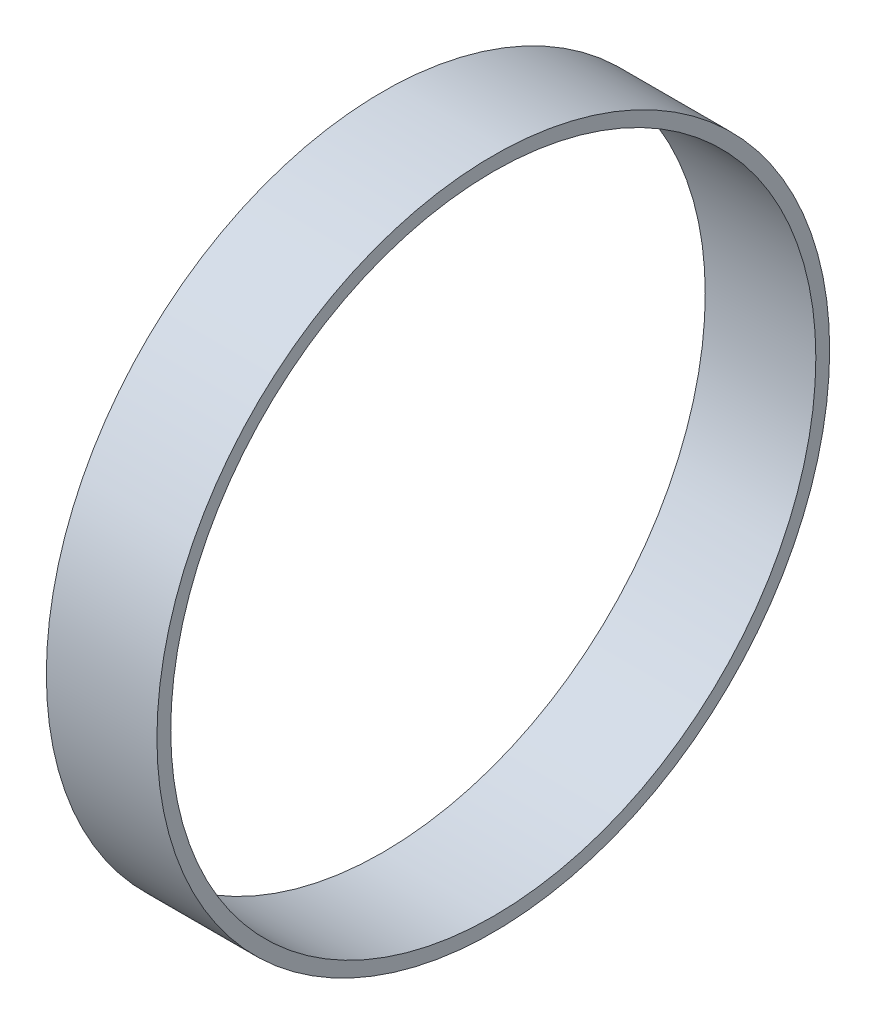
ISO-10303-21;
HEADER;
FILE_DESCRIPTION(('STEP AP214'),'2;1');
FILE_NAME('part.step','',(''),(''),'','','');
FILE_SCHEMA(('AUTOMOTIVE_DESIGN { 1 0 10303 214 1 1 1 1 }'));
ENDSEC;
DATA;
#1=APPLICATION_CONTEXT('core data for automotive mechanical design processes');
#2=APPLICATION_PROTOCOL_DEFINITION('international standard','automotive_design',2000,#1);
#3=PRODUCT_CONTEXT('',#1,'mechanical');
#4=PRODUCT('Part','Part','',(#3));
#5=PRODUCT_RELATED_PRODUCT_CATEGORY('part','',(#4));
#6=PRODUCT_DEFINITION_FORMATION('','',#4);
#7=PRODUCT_DEFINITION_CONTEXT('part definition',#1,'design');
#8=PRODUCT_DEFINITION('design','',#6,#7);
#9=PRODUCT_DEFINITION_SHAPE('','',#8);
#10=(LENGTH_UNIT() NAMED_UNIT(*) SI_UNIT(.MILLI.,.METRE.));
#11=(NAMED_UNIT(*) PLANE_ANGLE_UNIT() SI_UNIT($,.RADIAN.));
#12=(NAMED_UNIT(*) SI_UNIT($,.STERADIAN.) SOLID_ANGLE_UNIT());
#13=UNCERTAINTY_MEASURE_WITH_UNIT(LENGTH_MEASURE(1.E-05),#10,'distance_accuracy_value','');
#14=(GEOMETRIC_REPRESENTATION_CONTEXT(3) GLOBAL_UNCERTAINTY_ASSIGNED_CONTEXT((#13)) GLOBAL_UNIT_ASSIGNED_CONTEXT((#10,
#11,#12)) REPRESENTATION_CONTEXT('',''));
#15=CARTESIAN_POINT('',(0.,0.,0.));
#16=DIRECTION('',(0.,0.,1.));
#17=DIRECTION('',(1.,0.,0.));
#18=AXIS2_PLACEMENT_3D('',#15,#16,#17);
#19=CARTESIAN_POINT('',(12.,22.1154078837438,28.5428887873422));
#20=DIRECTION('',(1.,0.,0.));
#21=DIRECTION('',(0.,0.,-1.));
#22=AXIS2_PLACEMENT_3D('',#19,#20,#21);
#23=PLANE('',#22);
#24=CARTESIAN_POINT('',(12.,22.1154078837438,28.5428887873422));
#25=DIRECTION('',(1.,0.,0.));
#26=DIRECTION('',(0.,0.,-1.));
#27=AXIS2_PLACEMENT_3D('',#24,#25,#26);
#28=CIRCLE('',#27,36.5);
#29=CARTESIAN_POINT('',(12.,22.1154078837438,-7.95711121265777));
#30=VERTEX_POINT('',#29);
#31=EDGE_CURVE('E12',#30,#30,#28,.T.);
#32=ORIENTED_EDGE('',*,*,#31,.T.);
#33=EDGE_LOOP('',(#32));
#34=FACE_BOUND('',#33,.T.);
#35=CARTESIAN_POINT('',(12.,22.1154078837438,28.5428887873422));
#36=DIRECTION('',(1.,0.,0.));
#37=DIRECTION('',(0.,0.,-1.));
#38=AXIS2_PLACEMENT_3D('',#35,#36,#37);
#39=CIRCLE('',#38,35.);
#40=CARTESIAN_POINT('',(12.,22.1154078837438,-6.45711121265778));
#41=VERTEX_POINT('',#40);
#42=EDGE_CURVE('E57',#41,#41,#39,.T.);
#43=ORIENTED_EDGE('',*,*,#42,.F.);
#44=EDGE_LOOP('',(#43));
#45=FACE_BOUND('',#44,.T.);
#46=ADVANCED_FACE('F46',(#34,#45),#23,.T.);
#47=CARTESIAN_POINT('',(0.,22.1154078837438,28.5428887873422));
#48=DIRECTION('',(1.,0.,0.));
#49=DIRECTION('',(0.,0.,-1.));
#50=AXIS2_PLACEMENT_3D('',#47,#48,#49);
#51=PLANE('',#50);
#52=CARTESIAN_POINT('',(0.,22.1154078837438,28.5428887873422));
#53=DIRECTION('',(1.,0.,0.));
#54=DIRECTION('',(0.,0.,-1.));
#55=AXIS2_PLACEMENT_3D('',#52,#53,#54);
#56=CIRCLE('',#55,36.5);
#57=CARTESIAN_POINT('',(0.,22.1154078837438,-7.95711121265777));
#58=VERTEX_POINT('',#57);
#59=EDGE_CURVE('E50',#58,#58,#56,.T.);
#60=ORIENTED_EDGE('',*,*,#59,.F.);
#61=EDGE_LOOP('',(#60));
#62=FACE_BOUND('',#61,.T.);
#63=CARTESIAN_POINT('',(0.,22.1154078837438,28.5428887873422));
#64=DIRECTION('',(1.,0.,0.));
#65=DIRECTION('',(0.,0.,-1.));
#66=AXIS2_PLACEMENT_3D('',#63,#64,#65);
#67=CIRCLE('',#66,35.);
#68=CARTESIAN_POINT('',(0.,22.1154078837438,-6.45711121265778));
#69=VERTEX_POINT('',#68);
#70=EDGE_CURVE('E59',#69,#69,#67,.T.);
#71=ORIENTED_EDGE('',*,*,#70,.T.);
#72=EDGE_LOOP('',(#71));
#73=FACE_BOUND('',#72,.T.);
#74=ADVANCED_FACE('F69',(#62,#73),#51,.F.);
#75=CARTESIAN_POINT('',(12.,22.1154078837438,28.5428887873422));
#76=DIRECTION('',(-1.,0.,0.));
#77=DIRECTION('',(0.,0.,1.));
#78=AXIS2_PLACEMENT_3D('',#75,#76,#77);
#79=CYLINDRICAL_SURFACE('',#78,36.5);
#80=ORIENTED_EDGE('',*,*,#31,.F.);
#81=EDGE_LOOP('',(#80));
#82=FACE_BOUND('',#81,.T.);
#83=ORIENTED_EDGE('',*,*,#59,.T.);
#84=EDGE_LOOP('',(#83));
#85=FACE_BOUND('',#84,.T.);
#86=ADVANCED_FACE('F48',(#82,#85),#79,.T.);
#87=CARTESIAN_POINT('',(12.,22.1154078837438,28.5428887873422));
#88=DIRECTION('',(-1.,0.,0.));
#89=DIRECTION('',(0.,0.,1.));
#90=AXIS2_PLACEMENT_3D('',#87,#88,#89);
#91=CYLINDRICAL_SURFACE('',#90,35.);
#92=ORIENTED_EDGE('',*,*,#42,.T.);
#93=EDGE_LOOP('',(#92));
#94=FACE_BOUND('',#93,.T.);
#95=ORIENTED_EDGE('',*,*,#70,.F.);
#96=EDGE_LOOP('',(#95));
#97=FACE_BOUND('',#96,.T.);
#98=ADVANCED_FACE('F65',(#94,#97),#91,.F.);
#99=CLOSED_SHELL('',(#46,#74,#86,#98));
#100=MANIFOLD_SOLID_BREP('B2',#99);
#101=ADVANCED_BREP_SHAPE_REPRESENTATION('',(#18,#100),#14);
#102=SHAPE_DEFINITION_REPRESENTATION(#9,#101);
ENDSEC;
END-ISO-10303-21;
